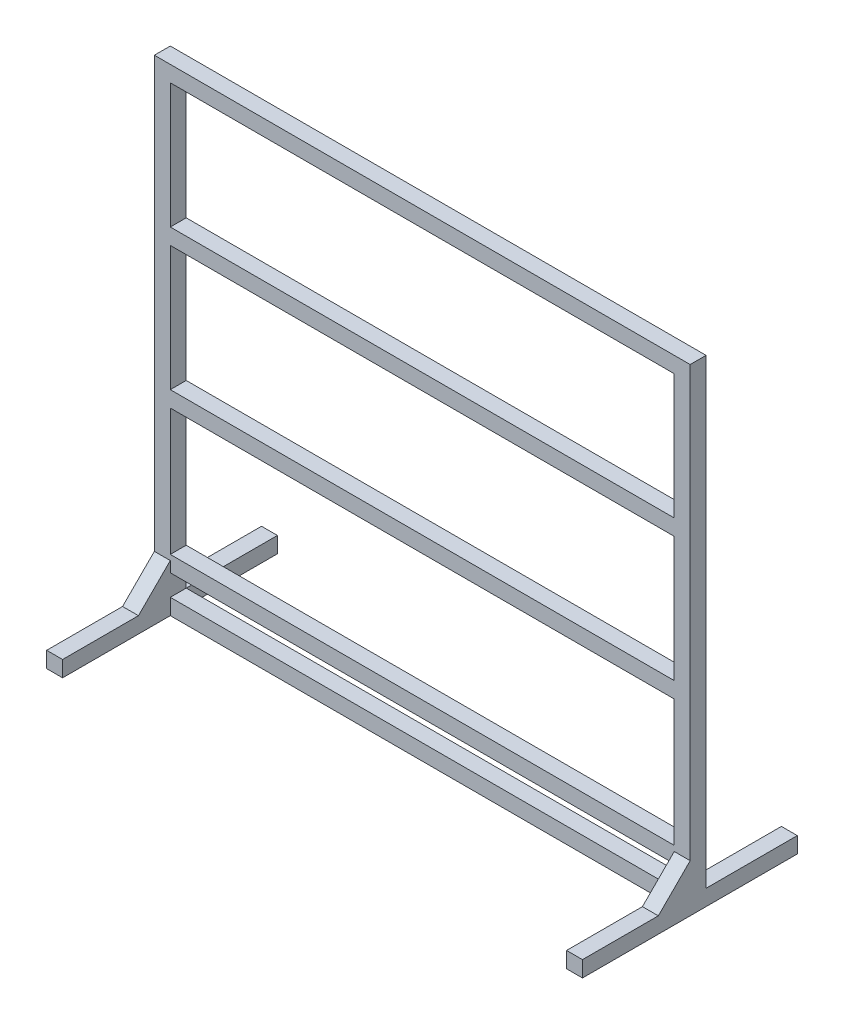
ISO-10303-21;
HEADER;
FILE_DESCRIPTION(('STEP AP214'),'2;1');
FILE_NAME('part.step','',(''),(''),'','','');
FILE_SCHEMA(('AUTOMOTIVE_DESIGN { 1 0 10303 214 1 1 1 1 }'));
ENDSEC;
DATA;
#1=APPLICATION_CONTEXT('core data for automotive mechanical design processes');
#2=APPLICATION_PROTOCOL_DEFINITION('international standard','automotive_design',2000,#1);
#3=PRODUCT_CONTEXT('',#1,'mechanical');
#4=PRODUCT('Part','Part','',(#3));
#5=PRODUCT_RELATED_PRODUCT_CATEGORY('part','',(#4));
#6=PRODUCT_DEFINITION_FORMATION('','',#4);
#7=PRODUCT_DEFINITION_CONTEXT('part definition',#1,'design');
#8=PRODUCT_DEFINITION('design','',#6,#7);
#9=PRODUCT_DEFINITION_SHAPE('','',#8);
#10=(LENGTH_UNIT() NAMED_UNIT(*) SI_UNIT(.MILLI.,.METRE.));
#11=(NAMED_UNIT(*) PLANE_ANGLE_UNIT() SI_UNIT($,.RADIAN.));
#12=(NAMED_UNIT(*) SI_UNIT($,.STERADIAN.) SOLID_ANGLE_UNIT());
#13=UNCERTAINTY_MEASURE_WITH_UNIT(LENGTH_MEASURE(1.E-05),#10,'distance_accuracy_value','');
#14=(GEOMETRIC_REPRESENTATION_CONTEXT(3) GLOBAL_UNCERTAINTY_ASSIGNED_CONTEXT((#13)) GLOBAL_UNIT_ASSIGNED_CONTEXT((#10,
#11,#12)) REPRESENTATION_CONTEXT('',''));
#15=CARTESIAN_POINT('',(0.,0.,0.));
#16=DIRECTION('',(0.,0.,1.));
#17=DIRECTION('',(1.,0.,0.));
#18=AXIS2_PLACEMENT_3D('',#15,#16,#17);
#19=CARTESIAN_POINT('',(0.,0.,0.));
#20=DIRECTION('',(0.,0.,1.));
#21=DIRECTION('',(1.,0.,0.));
#22=AXIS2_PLACEMENT_3D('',#19,#20,#21);
#23=PLANE('',#22);
#24=DIRECTION('',(0.,1.,0.));
#25=VECTOR('',#24,1.);
#26=CARTESIAN_POINT('',(980.,-870.,0.));
#27=LINE('',#26,#25);
#28=CARTESIAN_POINT('',(980.,-900.,0.));
#29=VERTEX_POINT('',#28);
#30=CARTESIAN_POINT('',(980.,-870.,0.));
#31=VERTEX_POINT('',#30);
#32=EDGE_CURVE('E514',#29,#31,#27,.T.);
#33=ORIENTED_EDGE('',*,*,#32,.F.);
#34=DIRECTION('',(1.,0.,0.));
#35=VECTOR('',#34,1.);
#36=CARTESIAN_POINT('',(0.,-900.,0.));
#37=LINE('',#36,#35);
#38=CARTESIAN_POINT('',(30.,-900.,0.));
#39=VERTEX_POINT('',#38);
#40=EDGE_CURVE('E305',#39,#29,#37,.T.);
#41=ORIENTED_EDGE('',*,*,#40,.F.);
#42=DIRECTION('',(0.,-1.,0.));
#43=VECTOR('',#42,1.);
#44=CARTESIAN_POINT('',(30.,-870.,0.));
#45=LINE('',#44,#43);
#46=CARTESIAN_POINT('',(30.,-870.,0.));
#47=VERTEX_POINT('',#46);
#48=EDGE_CURVE('E538',#47,#39,#45,.T.);
#49=ORIENTED_EDGE('',*,*,#48,.F.);
#50=DIRECTION('',(1.,0.,0.));
#51=VECTOR('',#50,1.);
#52=CARTESIAN_POINT('',(0.,-870.,0.));
#53=LINE('',#52,#51);
#54=EDGE_CURVE('E256',#47,#31,#53,.T.);
#55=ORIENTED_EDGE('',*,*,#54,.T.);
#56=EDGE_LOOP('',(#33,#41,#49,#55));
#57=FACE_BOUND('',#56,.T.);
#58=ADVANCED_FACE('F35',(#57),#23,.F.);
#59=DIRECTION('',(0.,-1.,0.));
#60=VECTOR('',#59,1.);
#61=CARTESIAN_POINT('',(30.,0.,0.));
#62=LINE('',#61,#60);
#63=CARTESIAN_POINT('',(30.,-295.5,0.));
#64=VERTEX_POINT('',#63);
#65=CARTESIAN_POINT('',(30.,-531.,0.));
#66=VERTEX_POINT('',#65);
#67=EDGE_CURVE('E300',#64,#66,#62,.T.);
#68=ORIENTED_EDGE('',*,*,#67,.T.);
#69=DIRECTION('',(1.,0.,0.));
#70=VECTOR('',#69,1.);
#71=CARTESIAN_POINT('',(0.,-531.,0.));
#72=LINE('',#71,#70);
#73=CARTESIAN_POINT('',(980.,-531.,0.));
#74=VERTEX_POINT('',#73);
#75=EDGE_CURVE('E348',#66,#74,#72,.T.);
#76=ORIENTED_EDGE('',*,*,#75,.T.);
#77=DIRECTION('',(0.,-1.,0.));
#78=VECTOR('',#77,1.);
#79=CARTESIAN_POINT('',(980.,0.,0.));
#80=LINE('',#79,#78);
#81=CARTESIAN_POINT('',(980.,-295.5,0.));
#82=VERTEX_POINT('',#81);
#83=EDGE_CURVE('E345',#82,#74,#80,.T.);
#84=ORIENTED_EDGE('',*,*,#83,.F.);
#85=DIRECTION('',(1.,0.,0.));
#86=VECTOR('',#85,1.);
#87=CARTESIAN_POINT('',(0.,-295.5,0.));
#88=LINE('',#87,#86);
#89=EDGE_CURVE('E341',#64,#82,#88,.T.);
#90=ORIENTED_EDGE('',*,*,#89,.F.);
#91=EDGE_LOOP('',(#68,#76,#84,#90));
#92=FACE_BOUND('',#91,.T.);
#93=CARTESIAN_POINT('',(30.,-561.,0.));
#94=VERTEX_POINT('',#93);
#95=CARTESIAN_POINT('',(30.,-800.,0.));
#96=VERTEX_POINT('',#95);
#97=EDGE_CURVE('E343',#94,#96,#62,.T.);
#98=ORIENTED_EDGE('',*,*,#97,.T.);
#99=DIRECTION('',(1.,0.,0.));
#100=VECTOR('',#99,1.);
#101=CARTESIAN_POINT('',(0.,-800.,0.));
#102=LINE('',#101,#100);
#103=CARTESIAN_POINT('',(980.,-800.,0.));
#104=VERTEX_POINT('',#103);
#105=EDGE_CURVE('E356',#96,#104,#102,.T.);
#106=ORIENTED_EDGE('',*,*,#105,.T.);
#107=CARTESIAN_POINT('',(980.,-561.,0.));
#108=VERTEX_POINT('',#107);
#109=EDGE_CURVE('E350',#108,#104,#80,.T.);
#110=ORIENTED_EDGE('',*,*,#109,.F.);
#111=DIRECTION('',(1.,0.,0.));
#112=VECTOR('',#111,1.);
#113=CARTESIAN_POINT('',(0.,-561.,0.));
#114=LINE('',#113,#112);
#115=EDGE_CURVE('E353',#94,#108,#114,.T.);
#116=ORIENTED_EDGE('',*,*,#115,.F.);
#117=EDGE_LOOP('',(#98,#106,#110,#116));
#118=FACE_BOUND('',#117,.T.);
#119=CARTESIAN_POINT('',(30.,-30.,0.));
#120=VERTEX_POINT('',#119);
#121=CARTESIAN_POINT('',(30.,-265.5,0.));
#122=VERTEX_POINT('',#121);
#123=EDGE_CURVE('E342',#120,#122,#62,.T.);
#124=ORIENTED_EDGE('',*,*,#123,.T.);
#125=DIRECTION('',(1.,0.,0.));
#126=VECTOR('',#125,1.);
#127=CARTESIAN_POINT('',(0.,-265.5,0.));
#128=LINE('',#127,#126);
#129=CARTESIAN_POINT('',(980.,-265.5,0.));
#130=VERTEX_POINT('',#129);
#131=EDGE_CURVE('E368',#122,#130,#128,.T.);
#132=ORIENTED_EDGE('',*,*,#131,.T.);
#133=CARTESIAN_POINT('',(980.,-30.,0.));
#134=VERTEX_POINT('',#133);
#135=EDGE_CURVE('E349',#134,#130,#80,.T.);
#136=ORIENTED_EDGE('',*,*,#135,.F.);
#137=DIRECTION('',(1.,0.,0.));
#138=VECTOR('',#137,1.);
#139=CARTESIAN_POINT('',(0.,-30.,0.));
#140=LINE('',#139,#138);
#141=EDGE_CURVE('E365',#120,#134,#140,.T.);
#142=ORIENTED_EDGE('',*,*,#141,.F.);
#143=EDGE_LOOP('',(#124,#132,#136,#142));
#144=FACE_BOUND('',#143,.T.);
#145=DIRECTION('',(1.,0.,0.));
#146=VECTOR('',#145,1.);
#147=CARTESIAN_POINT('',(980.,-870.,0.));
#148=LINE('',#147,#146);
#149=CARTESIAN_POINT('',(1010.,-870.,0.));
#150=VERTEX_POINT('',#149);
#151=EDGE_CURVE('E521',#31,#150,#148,.T.);
#152=ORIENTED_EDGE('',*,*,#151,.F.);
#153=CARTESIAN_POINT('',(980.,-830.,0.));
#154=VERTEX_POINT('',#153);
#155=EDGE_CURVE('E363',#154,#31,#80,.T.);
#156=ORIENTED_EDGE('',*,*,#155,.F.);
#157=DIRECTION('',(1.,0.,0.));
#158=VECTOR('',#157,1.);
#159=CARTESIAN_POINT('',(0.,-830.,0.));
#160=LINE('',#159,#158);
#161=CARTESIAN_POINT('',(30.,-830.,0.));
#162=VERTEX_POINT('',#161);
#163=EDGE_CURVE('E360',#162,#154,#160,.T.);
#164=ORIENTED_EDGE('',*,*,#163,.F.);
#165=EDGE_CURVE('E359',#162,#47,#62,.T.);
#166=ORIENTED_EDGE('',*,*,#165,.T.);
#167=DIRECTION('',(1.,0.,0.));
#168=VECTOR('',#167,1.);
#169=CARTESIAN_POINT('',(30.,-870.,0.));
#170=LINE('',#169,#168);
#171=CARTESIAN_POINT('',(1.0654427152582E-13,-870.,0.));
#172=VERTEX_POINT('',#171);
#173=EDGE_CURVE('E543',#172,#47,#170,.T.);
#174=ORIENTED_EDGE('',*,*,#173,.F.);
#175=DIRECTION('',(0.,-1.,0.));
#176=VECTOR('',#175,1.);
#177=CARTESIAN_POINT('',(0.,0.,0.));
#178=LINE('',#177,#176);
#179=CARTESIAN_POINT('',(0.,0.,0.));
#180=VERTEX_POINT('',#179);
#181=EDGE_CURVE('E377',#180,#172,#178,.T.);
#182=ORIENTED_EDGE('',*,*,#181,.F.);
#183=DIRECTION('',(1.,0.,0.));
#184=VECTOR('',#183,1.);
#185=CARTESIAN_POINT('',(0.,0.,0.));
#186=LINE('',#185,#184);
#187=CARTESIAN_POINT('',(1010.,0.,0.));
#188=VERTEX_POINT('',#187);
#189=EDGE_CURVE('E374',#180,#188,#186,.T.);
#190=ORIENTED_EDGE('',*,*,#189,.T.);
#191=DIRECTION('',(0.,-1.,0.));
#192=VECTOR('',#191,1.);
#193=CARTESIAN_POINT('',(1010.,0.,0.));
#194=LINE('',#193,#192);
#195=EDGE_CURVE('E371',#188,#150,#194,.T.);
#196=ORIENTED_EDGE('',*,*,#195,.T.);
#197=EDGE_LOOP('',(#152,#156,#164,#166,#174,#182,#190,#196));
#198=FACE_BOUND('',#197,.T.);
#199=ADVANCED_FACE('F425',(#92,#118,#144,#198),#23,.F.);
#200=CARTESIAN_POINT('',(0.,0.,30.));
#201=DIRECTION('',(0.,0.,1.));
#202=DIRECTION('',(1.,0.,0.));
#203=AXIS2_PLACEMENT_3D('',#200,#201,#202);
#204=PLANE('',#203);
#205=DIRECTION('',(1.,0.,0.));
#206=VECTOR('',#205,1.);
#207=CARTESIAN_POINT('',(0.,-900.,30.));
#208=LINE('',#207,#206);
#209=CARTESIAN_POINT('',(30.,-900.,30.));
#210=VERTEX_POINT('',#209);
#211=CARTESIAN_POINT('',(980.,-900.,30.));
#212=VERTEX_POINT('',#211);
#213=EDGE_CURVE('E336',#210,#212,#208,.T.);
#214=ORIENTED_EDGE('',*,*,#213,.T.);
#215=DIRECTION('',(0.,-1.,0.));
#216=VECTOR('',#215,1.);
#217=CARTESIAN_POINT('',(980.,-870.,30.));
#218=LINE('',#217,#216);
#219=CARTESIAN_POINT('',(980.,-870.,30.));
#220=VERTEX_POINT('',#219);
#221=EDGE_CURVE('E271',#220,#212,#218,.T.);
#222=ORIENTED_EDGE('',*,*,#221,.F.);
#223=DIRECTION('',(1.,0.,0.));
#224=VECTOR('',#223,1.);
#225=CARTESIAN_POINT('',(0.,-870.,30.));
#226=LINE('',#225,#224);
#227=CARTESIAN_POINT('',(30.0000000000001,-870.,30.));
#228=VERTEX_POINT('',#227);
#229=EDGE_CURVE('E254',#228,#220,#226,.T.);
#230=ORIENTED_EDGE('',*,*,#229,.F.);
#231=DIRECTION('',(0.,1.,0.));
#232=VECTOR('',#231,1.);
#233=CARTESIAN_POINT('',(30.,-870.,30.));
#234=LINE('',#233,#232);
#235=EDGE_CURVE('E268',#210,#228,#234,.T.);
#236=ORIENTED_EDGE('',*,*,#235,.F.);
#237=EDGE_LOOP('',(#214,#222,#230,#236));
#238=FACE_BOUND('',#237,.T.);
#239=ADVANCED_FACE('F267',(#238),#204,.T.);
#240=DIRECTION('',(1.,0.,0.));
#241=VECTOR('',#240,1.);
#242=CARTESIAN_POINT('',(980.,-810.,30.));
#243=LINE('',#242,#241);
#244=CARTESIAN_POINT('',(980.,-810.,30.));
#245=VERTEX_POINT('',#244);
#246=CARTESIAN_POINT('',(1010.,-810.,30.));
#247=VERTEX_POINT('',#246);
#248=EDGE_CURVE('E56',#245,#247,#243,.T.);
#249=ORIENTED_EDGE('',*,*,#248,.T.);
#250=DIRECTION('',(0.,-1.,0.));
#251=VECTOR('',#250,1.);
#252=CARTESIAN_POINT('',(1010.,0.,30.));
#253=LINE('',#252,#251);
#254=CARTESIAN_POINT('',(1010.,0.,30.));
#255=VERTEX_POINT('',#254);
#256=EDGE_CURVE('E328',#255,#247,#253,.T.);
#257=ORIENTED_EDGE('',*,*,#256,.F.);
#258=DIRECTION('',(1.,0.,0.));
#259=VECTOR('',#258,1.);
#260=CARTESIAN_POINT('',(0.,0.,30.));
#261=LINE('',#260,#259);
#262=CARTESIAN_POINT('',(0.,0.,30.));
#263=VERTEX_POINT('',#262);
#264=EDGE_CURVE('E330',#263,#255,#261,.T.);
#265=ORIENTED_EDGE('',*,*,#264,.F.);
#266=DIRECTION('',(0.,-1.,0.));
#267=VECTOR('',#266,1.);
#268=CARTESIAN_POINT('',(0.,0.,30.));
#269=LINE('',#268,#267);
#270=CARTESIAN_POINT('',(0.,-810.,30.));
#271=VERTEX_POINT('',#270);
#272=EDGE_CURVE('E333',#263,#271,#269,.T.);
#273=ORIENTED_EDGE('',*,*,#272,.T.);
#274=DIRECTION('',(-1.,0.,0.));
#275=VECTOR('',#274,1.);
#276=CARTESIAN_POINT('',(30.0000000000001,-810.,30.));
#277=LINE('',#276,#275);
#278=CARTESIAN_POINT('',(30.0000000000001,-810.,30.));
#279=VERTEX_POINT('',#278);
#280=EDGE_CURVE('E512',#279,#271,#277,.T.);
#281=ORIENTED_EDGE('',*,*,#280,.F.);
#282=DIRECTION('',(0.,-1.,0.));
#283=VECTOR('',#282,1.);
#284=CARTESIAN_POINT('',(30.0000000000001,-870.,30.));
#285=LINE('',#284,#283);
#286=CARTESIAN_POINT('',(30.0000000000001,-830.,30.));
#287=VERTEX_POINT('',#286);
#288=EDGE_CURVE('E504',#279,#287,#285,.T.);
#289=ORIENTED_EDGE('',*,*,#288,.T.);
#290=DIRECTION('',(1.,0.,0.));
#291=VECTOR('',#290,1.);
#292=CARTESIAN_POINT('',(0.,-830.,30.));
#293=LINE('',#292,#291);
#294=CARTESIAN_POINT('',(980.,-830.,30.));
#295=VERTEX_POINT('',#294);
#296=EDGE_CURVE('E274',#287,#295,#293,.T.);
#297=ORIENTED_EDGE('',*,*,#296,.T.);
#298=DIRECTION('',(0.,1.,0.));
#299=VECTOR('',#298,1.);
#300=CARTESIAN_POINT('',(980.,-810.,30.));
#301=LINE('',#300,#299);
#302=EDGE_CURVE('E52',#295,#245,#301,.T.);
#303=ORIENTED_EDGE('',*,*,#302,.T.);
#304=EDGE_LOOP('',(#249,#257,#265,#273,#281,#289,#297,#303));
#305=FACE_BOUND('',#304,.T.);
#306=DIRECTION('',(0.,-1.,0.));
#307=VECTOR('',#306,1.);
#308=CARTESIAN_POINT('',(30.,0.,30.));
#309=LINE('',#308,#307);
#310=CARTESIAN_POINT('',(30.,-295.5,30.));
#311=VERTEX_POINT('',#310);
#312=CARTESIAN_POINT('',(30.,-531.,30.));
#313=VERTEX_POINT('',#312);
#314=EDGE_CURVE('E301',#311,#313,#309,.T.);
#315=ORIENTED_EDGE('',*,*,#314,.F.);
#316=DIRECTION('',(1.,0.,0.));
#317=VECTOR('',#316,1.);
#318=CARTESIAN_POINT('',(0.,-295.5,30.));
#319=LINE('',#318,#317);
#320=CARTESIAN_POINT('',(980.,-295.5,30.));
#321=VERTEX_POINT('',#320);
#322=EDGE_CURVE('E304',#311,#321,#319,.T.);
#323=ORIENTED_EDGE('',*,*,#322,.T.);
#324=DIRECTION('',(0.,-1.,0.));
#325=VECTOR('',#324,1.);
#326=CARTESIAN_POINT('',(980.,0.,30.));
#327=LINE('',#326,#325);
#328=CARTESIAN_POINT('',(980.,-531.,30.));
#329=VERTEX_POINT('',#328);
#330=EDGE_CURVE('E308',#321,#329,#327,.T.);
#331=ORIENTED_EDGE('',*,*,#330,.T.);
#332=DIRECTION('',(1.,0.,0.));
#333=VECTOR('',#332,1.);
#334=CARTESIAN_POINT('',(0.,-531.,30.));
#335=LINE('',#334,#333);
#336=EDGE_CURVE('E310',#313,#329,#335,.T.);
#337=ORIENTED_EDGE('',*,*,#336,.F.);
#338=EDGE_LOOP('',(#315,#323,#331,#337));
#339=FACE_BOUND('',#338,.T.);
#340=CARTESIAN_POINT('',(30.,-561.,30.));
#341=VERTEX_POINT('',#340);
#342=CARTESIAN_POINT('',(30.,-800.,30.));
#343=VERTEX_POINT('',#342);
#344=EDGE_CURVE('E306',#341,#343,#309,.T.);
#345=ORIENTED_EDGE('',*,*,#344,.F.);
#346=DIRECTION('',(1.,0.,0.));
#347=VECTOR('',#346,1.);
#348=CARTESIAN_POINT('',(0.,-561.,30.));
#349=LINE('',#348,#347);
#350=CARTESIAN_POINT('',(980.,-561.,30.));
#351=VERTEX_POINT('',#350);
#352=EDGE_CURVE('E315',#341,#351,#349,.T.);
#353=ORIENTED_EDGE('',*,*,#352,.T.);
#354=CARTESIAN_POINT('',(980.,-800.,30.));
#355=VERTEX_POINT('',#354);
#356=EDGE_CURVE('E312',#351,#355,#327,.T.);
#357=ORIENTED_EDGE('',*,*,#356,.T.);
#358=DIRECTION('',(1.,0.,0.));
#359=VECTOR('',#358,1.);
#360=CARTESIAN_POINT('',(0.,-800.,30.));
#361=LINE('',#360,#359);
#362=EDGE_CURVE('E318',#343,#355,#361,.T.);
#363=ORIENTED_EDGE('',*,*,#362,.F.);
#364=EDGE_LOOP('',(#345,#353,#357,#363));
#365=FACE_BOUND('',#364,.T.);
#366=CARTESIAN_POINT('',(30.,-30.,30.));
#367=VERTEX_POINT('',#366);
#368=CARTESIAN_POINT('',(30.,-265.5,30.));
#369=VERTEX_POINT('',#368);
#370=EDGE_CURVE('E273',#367,#369,#309,.T.);
#371=ORIENTED_EDGE('',*,*,#370,.F.);
#372=DIRECTION('',(1.,0.,0.));
#373=VECTOR('',#372,1.);
#374=CARTESIAN_POINT('',(0.,-30.,30.));
#375=LINE('',#374,#373);
#376=CARTESIAN_POINT('',(980.,-30.,30.));
#377=VERTEX_POINT('',#376);
#378=EDGE_CURVE('E322',#367,#377,#375,.T.);
#379=ORIENTED_EDGE('',*,*,#378,.T.);
#380=CARTESIAN_POINT('',(980.,-265.5,30.));
#381=VERTEX_POINT('',#380);
#382=EDGE_CURVE('E311',#377,#381,#327,.T.);
#383=ORIENTED_EDGE('',*,*,#382,.T.);
#384=DIRECTION('',(1.,0.,0.));
#385=VECTOR('',#384,1.);
#386=CARTESIAN_POINT('',(0.,-265.5,30.));
#387=LINE('',#386,#385);
#388=EDGE_CURVE('E325',#369,#381,#387,.T.);
#389=ORIENTED_EDGE('',*,*,#388,.F.);
#390=EDGE_LOOP('',(#371,#379,#383,#389));
#391=FACE_BOUND('',#390,.T.);
#392=ADVANCED_FACE('F479',(#305,#339,#365,#391),#204,.T.);
#393=CARTESIAN_POINT('',(1010.,0.,30.));
#394=DIRECTION('',(1.,0.,0.));
#395=DIRECTION('',(0.,0.,-1.));
#396=AXIS2_PLACEMENT_3D('',#393,#394,#395);
#397=PLANE('',#396);
#398=ORIENTED_EDGE('',*,*,#256,.T.);
#399=DIRECTION('',(0.,-0.707106781186547,0.707106781186548));
#400=VECTOR('',#399,1.);
#401=CARTESIAN_POINT('',(1010.,-870.,90.));
#402=LINE('',#401,#400);
#403=CARTESIAN_POINT('',(1010.,-870.,90.0000000000001));
#404=VERTEX_POINT('',#403);
#405=EDGE_CURVE('E487',#247,#404,#402,.T.);
#406=ORIENTED_EDGE('',*,*,#405,.T.);
#407=DIRECTION('',(0.,0.,-1.));
#408=VECTOR('',#407,1.);
#409=CARTESIAN_POINT('',(1010.,-870.,233.));
#410=LINE('',#409,#408);
#411=CARTESIAN_POINT('',(1010.,-870.,233.));
#412=VERTEX_POINT('',#411);
#413=EDGE_CURVE('E287',#412,#404,#410,.T.);
#414=ORIENTED_EDGE('',*,*,#413,.F.);
#415=DIRECTION('',(0.,1.,0.));
#416=VECTOR('',#415,1.);
#417=CARTESIAN_POINT('',(1010.,-870.,233.));
#418=LINE('',#417,#416);
#419=CARTESIAN_POINT('',(1010.,-900.,233.));
#420=VERTEX_POINT('',#419);
#421=EDGE_CURVE('E569',#420,#412,#418,.T.);
#422=ORIENTED_EDGE('',*,*,#421,.F.);
#423=DIRECTION('',(0.,0.,-1.));
#424=VECTOR('',#423,1.);
#425=CARTESIAN_POINT('',(1010.,-900.,30.));
#426=LINE('',#425,#424);
#427=CARTESIAN_POINT('',(1010.,-900.,-172.));
#428=VERTEX_POINT('',#427);
#429=EDGE_CURVE('E382',#420,#428,#426,.T.);
#430=ORIENTED_EDGE('',*,*,#429,.T.);
#431=DIRECTION('',(0.,-1.,0.));
#432=VECTOR('',#431,1.);
#433=CARTESIAN_POINT('',(1010.,-870.,-172.));
#434=LINE('',#433,#432);
#435=CARTESIAN_POINT('',(1010.,-870.,-172.));
#436=VERTEX_POINT('',#435);
#437=EDGE_CURVE('E523',#436,#428,#434,.T.);
#438=ORIENTED_EDGE('',*,*,#437,.F.);
#439=DIRECTION('',(0.,0.,1.));
#440=VECTOR('',#439,1.);
#441=CARTESIAN_POINT('',(1010.,-870.,-172.));
#442=LINE('',#441,#440);
#443=EDGE_CURVE('E533',#436,#150,#442,.T.);
#444=ORIENTED_EDGE('',*,*,#443,.T.);
#445=ORIENTED_EDGE('',*,*,#195,.F.);
#446=DIRECTION('',(0.,0.,-1.));
#447=VECTOR('',#446,1.);
#448=CARTESIAN_POINT('',(1010.,0.,30.));
#449=LINE('',#448,#447);
#450=EDGE_CURVE('E11',#255,#188,#449,.T.);
#451=ORIENTED_EDGE('',*,*,#450,.F.);
#452=EDGE_LOOP('',(#398,#406,#414,#422,#430,#438,#444,#445,#451));
#453=FACE_BOUND('',#452,.T.);
#454=ADVANCED_FACE('F476',(#453),#397,.T.);
#455=CARTESIAN_POINT('',(0.,0.,30.));
#456=DIRECTION('',(0.,1.,0.));
#457=DIRECTION('',(0.,0.,1.));
#458=AXIS2_PLACEMENT_3D('',#455,#456,#457);
#459=PLANE('',#458);
#460=ORIENTED_EDGE('',*,*,#189,.F.);
#461=DIRECTION('',(0.,0.,-1.));
#462=VECTOR('',#461,1.);
#463=CARTESIAN_POINT('',(0.,0.,30.));
#464=LINE('',#463,#462);
#465=EDGE_CURVE('E44',#263,#180,#464,.T.);
#466=ORIENTED_EDGE('',*,*,#465,.F.);
#467=ORIENTED_EDGE('',*,*,#264,.T.);
#468=ORIENTED_EDGE('',*,*,#450,.T.);
#469=EDGE_LOOP('',(#460,#466,#467,#468));
#470=FACE_BOUND('',#469,.T.);
#471=ADVANCED_FACE('F472',(#470),#459,.T.);
#472=CARTESIAN_POINT('',(0.,0.,30.));
#473=DIRECTION('',(1.,0.,0.));
#474=DIRECTION('',(0.,1.,0.));
#475=AXIS2_PLACEMENT_3D('',#472,#473,#474);
#476=PLANE('',#475);
#477=ORIENTED_EDGE('',*,*,#181,.T.);
#478=DIRECTION('',(0.,0.,1.));
#479=VECTOR('',#478,1.);
#480=CARTESIAN_POINT('',(1.10218211923262E-13,-870.,-172.));
#481=LINE('',#480,#479);
#482=CARTESIAN_POINT('',(1.10218211923262E-13,-870.,-172.));
#483=VERTEX_POINT('',#482);
#484=EDGE_CURVE('E557',#483,#172,#481,.T.);
#485=ORIENTED_EDGE('',*,*,#484,.F.);
#486=DIRECTION('',(0.,1.,0.));
#487=VECTOR('',#486,1.);
#488=CARTESIAN_POINT('',(1.10218211923262E-13,-870.,-172.));
#489=LINE('',#488,#487);
#490=CARTESIAN_POINT('',(1.10218211923262E-13,-900.,-172.));
#491=VERTEX_POINT('',#490);
#492=EDGE_CURVE('E546',#491,#483,#489,.T.);
#493=ORIENTED_EDGE('',*,*,#492,.F.);
#494=DIRECTION('',(0.,0.,-1.));
#495=VECTOR('',#494,1.);
#496=CARTESIAN_POINT('',(1.10218211923262E-13,-900.,30.));
#497=LINE('',#496,#495);
#498=CARTESIAN_POINT('',(1.10218211923262E-13,-900.,233.));
#499=VERTEX_POINT('',#498);
#500=EDGE_CURVE('E384',#499,#491,#497,.T.);
#501=ORIENTED_EDGE('',*,*,#500,.F.);
#502=DIRECTION('',(0.,-1.,0.));
#503=VECTOR('',#502,1.);
#504=CARTESIAN_POINT('',(1.10218211923262E-13,-870.,233.));
#505=LINE('',#504,#503);
#506=CARTESIAN_POINT('',(1.10218211923262E-13,-870.,233.));
#507=VERTEX_POINT('',#506);
#508=EDGE_CURVE('E578',#507,#499,#505,.T.);
#509=ORIENTED_EDGE('',*,*,#508,.F.);
#510=DIRECTION('',(0.,0.,-1.));
#511=VECTOR('',#510,1.);
#512=CARTESIAN_POINT('',(1.10218211923262E-13,-870.,233.));
#513=LINE('',#512,#511);
#514=CARTESIAN_POINT('',(1.0654427152582E-13,-870.,90.));
#515=VERTEX_POINT('',#514);
#516=EDGE_CURVE('E294',#507,#515,#513,.T.);
#517=ORIENTED_EDGE('',*,*,#516,.T.);
#518=DIRECTION('',(0.,0.707106781186547,-0.707106781186548));
#519=VECTOR('',#518,1.);
#520=CARTESIAN_POINT('',(0.,-810.,30.));
#521=LINE('',#520,#519);
#522=EDGE_CURVE('E502',#515,#271,#521,.T.);
#523=ORIENTED_EDGE('',*,*,#522,.T.);
#524=ORIENTED_EDGE('',*,*,#272,.F.);
#525=ORIENTED_EDGE('',*,*,#465,.T.);
#526=EDGE_LOOP('',(#477,#485,#493,#501,#509,#517,#523,#524,#525));
#527=FACE_BOUND('',#526,.T.);
#528=ADVANCED_FACE('F468',(#527),#476,.F.);
#529=CARTESIAN_POINT('',(30.,0.,30.));
#530=DIRECTION('',(1.,0.,0.));
#531=DIRECTION('',(0.,0.,-1.));
#532=AXIS2_PLACEMENT_3D('',#529,#530,#531);
#533=PLANE('',#532);
#534=ORIENTED_EDGE('',*,*,#123,.F.);
#535=DIRECTION('',(0.,0.,-1.));
#536=VECTOR('',#535,1.);
#537=CARTESIAN_POINT('',(30.,-30.,30.));
#538=LINE('',#537,#536);
#539=EDGE_CURVE('E385',#367,#120,#538,.T.);
#540=ORIENTED_EDGE('',*,*,#539,.F.);
#541=ORIENTED_EDGE('',*,*,#370,.T.);
#542=DIRECTION('',(0.,0.,-1.));
#543=VECTOR('',#542,1.);
#544=CARTESIAN_POINT('',(30.,-265.5,30.));
#545=LINE('',#544,#543);
#546=EDGE_CURVE('E388',#369,#122,#545,.T.);
#547=ORIENTED_EDGE('',*,*,#546,.T.);
#548=EDGE_LOOP('',(#534,#540,#541,#547));
#549=FACE_BOUND('',#548,.T.);
#550=ADVANCED_FACE('F471',(#549),#533,.T.);
#551=CARTESIAN_POINT('',(0.,-30.,30.));
#552=DIRECTION('',(0.,1.,0.));
#553=DIRECTION('',(0.,0.,1.));
#554=AXIS2_PLACEMENT_3D('',#551,#552,#553);
#555=PLANE('',#554);
#556=ORIENTED_EDGE('',*,*,#141,.T.);
#557=DIRECTION('',(0.,0.,-1.));
#558=VECTOR('',#557,1.);
#559=CARTESIAN_POINT('',(980.,-30.,30.));
#560=LINE('',#559,#558);
#561=EDGE_CURVE('E393',#377,#134,#560,.T.);
#562=ORIENTED_EDGE('',*,*,#561,.F.);
#563=ORIENTED_EDGE('',*,*,#378,.F.);
#564=ORIENTED_EDGE('',*,*,#539,.T.);
#565=EDGE_LOOP('',(#556,#562,#563,#564));
#566=FACE_BOUND('',#565,.T.);
#567=ADVANCED_FACE('F451',(#566),#555,.F.);
#568=CARTESIAN_POINT('',(980.,0.,30.));
#569=DIRECTION('',(1.,0.,0.));
#570=DIRECTION('',(0.,0.,-1.));
#571=AXIS2_PLACEMENT_3D('',#568,#569,#570);
#572=PLANE('',#571);
#573=ORIENTED_EDGE('',*,*,#135,.T.);
#574=DIRECTION('',(0.,0.,-1.));
#575=VECTOR('',#574,1.);
#576=CARTESIAN_POINT('',(980.,-265.5,30.));
#577=LINE('',#576,#575);
#578=EDGE_CURVE('E390',#381,#130,#577,.T.);
#579=ORIENTED_EDGE('',*,*,#578,.F.);
#580=ORIENTED_EDGE('',*,*,#382,.F.);
#581=ORIENTED_EDGE('',*,*,#561,.T.);
#582=EDGE_LOOP('',(#573,#579,#580,#581));
#583=FACE_BOUND('',#582,.T.);
#584=ADVANCED_FACE('F438',(#583),#572,.F.);
#585=ORIENTED_EDGE('',*,*,#165,.F.);
#586=DIRECTION('',(0.,0.,-1.));
#587=VECTOR('',#586,1.);
#588=CARTESIAN_POINT('',(30.,-830.,30.));
#589=LINE('',#588,#587);
#590=EDGE_CURVE('E391',#287,#162,#589,.T.);
#591=ORIENTED_EDGE('',*,*,#590,.F.);
#592=ORIENTED_EDGE('',*,*,#288,.F.);
#593=DIRECTION('',(0.,0.707106781186547,-0.707106781186548));
#594=VECTOR('',#593,1.);
#595=CARTESIAN_POINT('',(30.0000000000001,-810.,30.));
#596=LINE('',#595,#594);
#597=CARTESIAN_POINT('',(30.0000000000001,-870.,90.));
#598=VERTEX_POINT('',#597);
#599=EDGE_CURVE('E506',#598,#279,#596,.T.);
#600=ORIENTED_EDGE('',*,*,#599,.F.);
#601=DIRECTION('',(0.,0.,-1.));
#602=VECTOR('',#601,1.);
#603=CARTESIAN_POINT('',(30.,-870.,233.));
#604=LINE('',#603,#602);
#605=CARTESIAN_POINT('',(30.,-870.,233.));
#606=VERTEX_POINT('',#605);
#607=EDGE_CURVE('E297',#606,#598,#604,.T.);
#608=ORIENTED_EDGE('',*,*,#607,.F.);
#609=DIRECTION('',(0.,1.,0.));
#610=VECTOR('',#609,1.);
#611=CARTESIAN_POINT('',(30.,-870.,233.));
#612=LINE('',#611,#610);
#613=CARTESIAN_POINT('',(30.,-900.,233.));
#614=VERTEX_POINT('',#613);
#615=EDGE_CURVE('E281',#614,#606,#612,.T.);
#616=ORIENTED_EDGE('',*,*,#615,.F.);
#617=DIRECTION('',(0.,0.,-1.));
#618=VECTOR('',#617,1.);
#619=CARTESIAN_POINT('',(30.,-900.,233.));
#620=LINE('',#619,#618);
#621=EDGE_CURVE('E280',#614,#210,#620,.T.);
#622=ORIENTED_EDGE('',*,*,#621,.T.);
#623=ORIENTED_EDGE('',*,*,#235,.T.);
#624=DIRECTION('',(0.,0.,-1.));
#625=VECTOR('',#624,1.);
#626=CARTESIAN_POINT('',(30.,-870.,30.));
#627=LINE('',#626,#625);
#628=EDGE_CURVE('E250',#228,#47,#627,.T.);
#629=ORIENTED_EDGE('',*,*,#628,.T.);
#630=EDGE_LOOP('',(#585,#591,#592,#600,#608,#616,#622,#623,#629));
#631=FACE_BOUND('',#630,.T.);
#632=ADVANCED_FACE('F277',(#631),#533,.T.);
#633=CARTESIAN_POINT('',(0.,-830.,30.));
#634=DIRECTION('',(0.,1.,0.));
#635=DIRECTION('',(0.,0.,1.));
#636=AXIS2_PLACEMENT_3D('',#633,#634,#635);
#637=PLANE('',#636);
#638=ORIENTED_EDGE('',*,*,#163,.T.);
#639=DIRECTION('',(0.,0.,-1.));
#640=VECTOR('',#639,1.);
#641=CARTESIAN_POINT('',(980.,-830.,30.));
#642=LINE('',#641,#640);
#643=EDGE_CURVE('E398',#295,#154,#642,.T.);
#644=ORIENTED_EDGE('',*,*,#643,.F.);
#645=ORIENTED_EDGE('',*,*,#296,.F.);
#646=ORIENTED_EDGE('',*,*,#590,.T.);
#647=EDGE_LOOP('',(#638,#644,#645,#646));
#648=FACE_BOUND('',#647,.T.);
#649=ADVANCED_FACE('F650',(#648),#637,.F.);
#650=ORIENTED_EDGE('',*,*,#155,.T.);
#651=DIRECTION('',(0.,0.,-1.));
#652=VECTOR('',#651,1.);
#653=CARTESIAN_POINT('',(980.,-870.,30.));
#654=LINE('',#653,#652);
#655=EDGE_CURVE('E262',#220,#31,#654,.T.);
#656=ORIENTED_EDGE('',*,*,#655,.F.);
#657=ORIENTED_EDGE('',*,*,#221,.T.);
#658=DIRECTION('',(0.,0.,-1.));
#659=VECTOR('',#658,1.);
#660=CARTESIAN_POINT('',(980.,-900.,233.));
#661=LINE('',#660,#659);
#662=CARTESIAN_POINT('',(980.,-900.,233.));
#663=VERTEX_POINT('',#662);
#664=EDGE_CURVE('E282',#663,#212,#661,.T.);
#665=ORIENTED_EDGE('',*,*,#664,.F.);
#666=DIRECTION('',(0.,-1.,0.));
#667=VECTOR('',#666,1.);
#668=CARTESIAN_POINT('',(980.,-870.,233.));
#669=LINE('',#668,#667);
#670=CARTESIAN_POINT('',(980.,-870.,233.));
#671=VERTEX_POINT('',#670);
#672=EDGE_CURVE('E563',#671,#663,#669,.T.);
#673=ORIENTED_EDGE('',*,*,#672,.F.);
#674=DIRECTION('',(0.,0.,-1.));
#675=VECTOR('',#674,1.);
#676=CARTESIAN_POINT('',(980.,-870.,233.));
#677=LINE('',#676,#675);
#678=CARTESIAN_POINT('',(980.,-870.,90.0000000000001));
#679=VERTEX_POINT('',#678);
#680=EDGE_CURVE('E573',#671,#679,#677,.T.);
#681=ORIENTED_EDGE('',*,*,#680,.T.);
#682=DIRECTION('',(0.,-0.707106781186547,0.707106781186548));
#683=VECTOR('',#682,1.);
#684=CARTESIAN_POINT('',(980.,-870.,90.));
#685=LINE('',#684,#683);
#686=EDGE_CURVE('E496',#245,#679,#685,.T.);
#687=ORIENTED_EDGE('',*,*,#686,.F.);
#688=ORIENTED_EDGE('',*,*,#302,.F.);
#689=ORIENTED_EDGE('',*,*,#643,.T.);
#690=EDGE_LOOP('',(#650,#656,#657,#665,#673,#681,#687,#688,#689));
#691=FACE_BOUND('',#690,.T.);
#692=ADVANCED_FACE('F449',(#691),#572,.F.);
#693=ORIENTED_EDGE('',*,*,#97,.F.);
#694=DIRECTION('',(0.,0.,-1.));
#695=VECTOR('',#694,1.);
#696=CARTESIAN_POINT('',(30.,-561.,30.));
#697=LINE('',#696,#695);
#698=EDGE_CURVE('E263',#341,#94,#697,.T.);
#699=ORIENTED_EDGE('',*,*,#698,.F.);
#700=ORIENTED_EDGE('',*,*,#344,.T.);
#701=DIRECTION('',(0.,0.,-1.));
#702=VECTOR('',#701,1.);
#703=CARTESIAN_POINT('',(30.,-800.,30.));
#704=LINE('',#703,#702);
#705=EDGE_CURVE('E402',#343,#96,#704,.T.);
#706=ORIENTED_EDGE('',*,*,#705,.T.);
#707=EDGE_LOOP('',(#693,#699,#700,#706));
#708=FACE_BOUND('',#707,.T.);
#709=ADVANCED_FACE('F639',(#708),#533,.T.);
#710=CARTESIAN_POINT('',(0.,-561.,30.));
#711=DIRECTION('',(0.,1.,0.));
#712=DIRECTION('',(0.,0.,1.));
#713=AXIS2_PLACEMENT_3D('',#710,#711,#712);
#714=PLANE('',#713);
#715=ORIENTED_EDGE('',*,*,#115,.T.);
#716=DIRECTION('',(0.,0.,-1.));
#717=VECTOR('',#716,1.);
#718=CARTESIAN_POINT('',(980.,-561.,30.));
#719=LINE('',#718,#717);
#720=EDGE_CURVE('E406',#351,#108,#719,.T.);
#721=ORIENTED_EDGE('',*,*,#720,.F.);
#722=ORIENTED_EDGE('',*,*,#352,.F.);
#723=ORIENTED_EDGE('',*,*,#698,.T.);
#724=EDGE_LOOP('',(#715,#721,#722,#723));
#725=FACE_BOUND('',#724,.T.);
#726=ADVANCED_FACE('F447',(#725),#714,.F.);
#727=ORIENTED_EDGE('',*,*,#109,.T.);
#728=DIRECTION('',(0.,0.,-1.));
#729=VECTOR('',#728,1.);
#730=CARTESIAN_POINT('',(980.,-800.,30.));
#731=LINE('',#730,#729);
#732=EDGE_CURVE('E404',#355,#104,#731,.T.);
#733=ORIENTED_EDGE('',*,*,#732,.F.);
#734=ORIENTED_EDGE('',*,*,#356,.F.);
#735=ORIENTED_EDGE('',*,*,#720,.T.);
#736=EDGE_LOOP('',(#727,#733,#734,#735));
#737=FACE_BOUND('',#736,.T.);
#738=ADVANCED_FACE('F437',(#737),#572,.F.);
#739=ORIENTED_EDGE('',*,*,#67,.F.);
#740=DIRECTION('',(0.,0.,-1.));
#741=VECTOR('',#740,1.);
#742=CARTESIAN_POINT('',(30.,-295.5,30.));
#743=LINE('',#742,#741);
#744=EDGE_CURVE('E39',#311,#64,#743,.T.);
#745=ORIENTED_EDGE('',*,*,#744,.F.);
#746=ORIENTED_EDGE('',*,*,#314,.T.);
#747=DIRECTION('',(0.,0.,-1.));
#748=VECTOR('',#747,1.);
#749=CARTESIAN_POINT('',(30.,-531.,30.));
#750=LINE('',#749,#748);
#751=EDGE_CURVE('E338',#313,#66,#750,.T.);
#752=ORIENTED_EDGE('',*,*,#751,.T.);
#753=EDGE_LOOP('',(#739,#745,#746,#752));
#754=FACE_BOUND('',#753,.T.);
#755=ADVANCED_FACE('F428',(#754),#533,.T.);
#756=CARTESIAN_POINT('',(0.,-295.5,30.));
#757=DIRECTION('',(0.,1.,0.));
#758=DIRECTION('',(0.,0.,1.));
#759=AXIS2_PLACEMENT_3D('',#756,#757,#758);
#760=PLANE('',#759);
#761=ORIENTED_EDGE('',*,*,#89,.T.);
#762=DIRECTION('',(0.,0.,-1.));
#763=VECTOR('',#762,1.);
#764=CARTESIAN_POINT('',(980.,-295.5,30.));
#765=LINE('',#764,#763);
#766=EDGE_CURVE('E412',#321,#82,#765,.T.);
#767=ORIENTED_EDGE('',*,*,#766,.F.);
#768=ORIENTED_EDGE('',*,*,#322,.F.);
#769=ORIENTED_EDGE('',*,*,#744,.T.);
#770=EDGE_LOOP('',(#761,#767,#768,#769));
#771=FACE_BOUND('',#770,.T.);
#772=ADVANCED_FACE('F37',(#771),#760,.F.);
#773=ORIENTED_EDGE('',*,*,#83,.T.);
#774=DIRECTION('',(0.,0.,-1.));
#775=VECTOR('',#774,1.);
#776=CARTESIAN_POINT('',(980.,-531.,30.));
#777=LINE('',#776,#775);
#778=EDGE_CURVE('E411',#329,#74,#777,.T.);
#779=ORIENTED_EDGE('',*,*,#778,.F.);
#780=ORIENTED_EDGE('',*,*,#330,.F.);
#781=ORIENTED_EDGE('',*,*,#766,.T.);
#782=EDGE_LOOP('',(#773,#779,#780,#781));
#783=FACE_BOUND('',#782,.T.);
#784=ADVANCED_FACE('F433',(#783),#572,.F.);
#785=CARTESIAN_POINT('',(0.,-265.5,30.));
#786=DIRECTION('',(0.,1.,0.));
#787=DIRECTION('',(0.,0.,1.));
#788=AXIS2_PLACEMENT_3D('',#785,#786,#787);
#789=PLANE('',#788);
#790=ORIENTED_EDGE('',*,*,#131,.F.);
#791=ORIENTED_EDGE('',*,*,#546,.F.);
#792=ORIENTED_EDGE('',*,*,#388,.T.);
#793=ORIENTED_EDGE('',*,*,#578,.T.);
#794=EDGE_LOOP('',(#790,#791,#792,#793));
#795=FACE_BOUND('',#794,.T.);
#796=ADVANCED_FACE('F435',(#795),#789,.T.);
#797=CARTESIAN_POINT('',(0.,-870.,30.));
#798=DIRECTION('',(0.,1.,0.));
#799=DIRECTION('',(0.,0.,1.));
#800=AXIS2_PLACEMENT_3D('',#797,#798,#799);
#801=PLANE('',#800);
#802=ORIENTED_EDGE('',*,*,#54,.F.);
#803=ORIENTED_EDGE('',*,*,#628,.F.);
#804=ORIENTED_EDGE('',*,*,#229,.T.);
#805=ORIENTED_EDGE('',*,*,#655,.T.);
#806=EDGE_LOOP('',(#802,#803,#804,#805));
#807=FACE_BOUND('',#806,.T.);
#808=ADVANCED_FACE('F252',(#807),#801,.T.);
#809=CARTESIAN_POINT('',(0.,-800.,30.));
#810=DIRECTION('',(0.,1.,0.));
#811=DIRECTION('',(0.,0.,1.));
#812=AXIS2_PLACEMENT_3D('',#809,#810,#811);
#813=PLANE('',#812);
#814=ORIENTED_EDGE('',*,*,#105,.F.);
#815=ORIENTED_EDGE('',*,*,#705,.F.);
#816=ORIENTED_EDGE('',*,*,#362,.T.);
#817=ORIENTED_EDGE('',*,*,#732,.T.);
#818=EDGE_LOOP('',(#814,#815,#816,#817));
#819=FACE_BOUND('',#818,.T.);
#820=ADVANCED_FACE('F634',(#819),#813,.T.);
#821=CARTESIAN_POINT('',(0.,-531.,30.));
#822=DIRECTION('',(0.,1.,0.));
#823=DIRECTION('',(0.,0.,1.));
#824=AXIS2_PLACEMENT_3D('',#821,#822,#823);
#825=PLANE('',#824);
#826=ORIENTED_EDGE('',*,*,#75,.F.);
#827=ORIENTED_EDGE('',*,*,#751,.F.);
#828=ORIENTED_EDGE('',*,*,#336,.T.);
#829=ORIENTED_EDGE('',*,*,#778,.T.);
#830=EDGE_LOOP('',(#826,#827,#828,#829));
#831=FACE_BOUND('',#830,.T.);
#832=ADVANCED_FACE('F431',(#831),#825,.T.);
#833=CARTESIAN_POINT('',(0.,-900.,30.));
#834=DIRECTION('',(0.,1.,0.));
#835=DIRECTION('',(0.,0.,1.));
#836=AXIS2_PLACEMENT_3D('',#833,#834,#835);
#837=PLANE('',#836);
#838=ORIENTED_EDGE('',*,*,#500,.T.);
#839=DIRECTION('',(-1.,0.,0.));
#840=VECTOR('',#839,1.);
#841=CARTESIAN_POINT('',(30.,-900.,-172.));
#842=LINE('',#841,#840);
#843=CARTESIAN_POINT('',(30.,-900.,-172.));
#844=VERTEX_POINT('',#843);
#845=EDGE_CURVE('E542',#844,#491,#842,.T.);
#846=ORIENTED_EDGE('',*,*,#845,.F.);
#847=DIRECTION('',(0.,0.,1.));
#848=VECTOR('',#847,1.);
#849=CARTESIAN_POINT('',(30.,-900.,-172.));
#850=LINE('',#849,#848);
#851=EDGE_CURVE('E560',#844,#39,#850,.T.);
#852=ORIENTED_EDGE('',*,*,#851,.T.);
#853=ORIENTED_EDGE('',*,*,#40,.T.);
#854=DIRECTION('',(0.,0.,1.));
#855=VECTOR('',#854,1.);
#856=CARTESIAN_POINT('',(980.,-900.,-172.));
#857=LINE('',#856,#855);
#858=CARTESIAN_POINT('',(980.,-900.,-172.));
#859=VERTEX_POINT('',#858);
#860=EDGE_CURVE('E528',#859,#29,#857,.T.);
#861=ORIENTED_EDGE('',*,*,#860,.F.);
#862=DIRECTION('',(-1.,0.,0.));
#863=VECTOR('',#862,1.);
#864=CARTESIAN_POINT('',(980.,-900.,-172.));
#865=LINE('',#864,#863);
#866=EDGE_CURVE('E526',#428,#859,#865,.T.);
#867=ORIENTED_EDGE('',*,*,#866,.F.);
#868=ORIENTED_EDGE('',*,*,#429,.F.);
#869=DIRECTION('',(1.,0.,0.));
#870=VECTOR('',#869,1.);
#871=CARTESIAN_POINT('',(980.,-900.,233.));
#872=LINE('',#871,#870);
#873=EDGE_CURVE('E566',#663,#420,#872,.T.);
#874=ORIENTED_EDGE('',*,*,#873,.F.);
#875=ORIENTED_EDGE('',*,*,#664,.T.);
#876=ORIENTED_EDGE('',*,*,#213,.F.);
#877=ORIENTED_EDGE('',*,*,#621,.F.);
#878=DIRECTION('',(1.,0.,0.));
#879=VECTOR('',#878,1.);
#880=CARTESIAN_POINT('',(30.,-900.,233.));
#881=LINE('',#880,#879);
#882=EDGE_CURVE('E291',#499,#614,#881,.T.);
#883=ORIENTED_EDGE('',*,*,#882,.F.);
#884=EDGE_LOOP('',(#838,#846,#852,#853,#861,#867,#868,#874,#875,#876,#877,#883));
#885=FACE_BOUND('',#884,.T.);
#886=ADVANCED_FACE('F463',(#885),#837,.F.);
#887=CARTESIAN_POINT('',(30.,-870.,233.));
#888=DIRECTION('',(0.,-1.,0.));
#889=DIRECTION('',(0.,0.,-1.));
#890=AXIS2_PLACEMENT_3D('',#887,#888,#889);
#891=PLANE('',#890);
#892=ORIENTED_EDGE('',*,*,#607,.T.);
#893=DIRECTION('',(-1.,0.,0.));
#894=VECTOR('',#893,1.);
#895=CARTESIAN_POINT('',(30.0000000000001,-870.,90.));
#896=LINE('',#895,#894);
#897=EDGE_CURVE('E509',#598,#515,#896,.T.);
#898=ORIENTED_EDGE('',*,*,#897,.T.);
#899=ORIENTED_EDGE('',*,*,#516,.F.);
#900=DIRECTION('',(-1.,0.,0.));
#901=VECTOR('',#900,1.);
#902=CARTESIAN_POINT('',(30.,-870.,233.));
#903=LINE('',#902,#901);
#904=EDGE_CURVE('E285',#606,#507,#903,.T.);
#905=ORIENTED_EDGE('',*,*,#904,.F.);
#906=EDGE_LOOP('',(#892,#898,#899,#905));
#907=FACE_BOUND('',#906,.T.);
#908=ADVANCED_FACE('F466',(#907),#891,.F.);
#909=CARTESIAN_POINT('',(0.,0.,233.));
#910=DIRECTION('',(0.,0.,-1.));
#911=DIRECTION('',(-1.,0.,0.));
#912=AXIS2_PLACEMENT_3D('',#909,#910,#911);
#913=PLANE('',#912);
#914=ORIENTED_EDGE('',*,*,#615,.T.);
#915=ORIENTED_EDGE('',*,*,#904,.T.);
#916=ORIENTED_EDGE('',*,*,#508,.T.);
#917=ORIENTED_EDGE('',*,*,#882,.T.);
#918=EDGE_LOOP('',(#914,#915,#916,#917));
#919=FACE_BOUND('',#918,.T.);
#920=ADVANCED_FACE('F583',(#919),#913,.F.);
#921=CARTESIAN_POINT('',(980.,-870.,233.));
#922=DIRECTION('',(0.,-1.,0.));
#923=DIRECTION('',(0.,0.,-1.));
#924=AXIS2_PLACEMENT_3D('',#921,#922,#923);
#925=PLANE('',#924);
#926=ORIENTED_EDGE('',*,*,#413,.T.);
#927=DIRECTION('',(1.,0.,0.));
#928=VECTOR('',#927,1.);
#929=CARTESIAN_POINT('',(980.,-870.,90.));
#930=LINE('',#929,#928);
#931=EDGE_CURVE('E495',#679,#404,#930,.T.);
#932=ORIENTED_EDGE('',*,*,#931,.F.);
#933=ORIENTED_EDGE('',*,*,#680,.F.);
#934=DIRECTION('',(-1.,0.,0.));
#935=VECTOR('',#934,1.);
#936=CARTESIAN_POINT('',(980.,-870.,233.));
#937=LINE('',#936,#935);
#938=EDGE_CURVE('E571',#412,#671,#937,.T.);
#939=ORIENTED_EDGE('',*,*,#938,.F.);
#940=EDGE_LOOP('',(#926,#932,#933,#939));
#941=FACE_BOUND('',#940,.T.);
#942=ADVANCED_FACE('F682',(#941),#925,.F.);
#943=CARTESIAN_POINT('',(0.,0.,233.));
#944=DIRECTION('',(0.,0.,1.));
#945=DIRECTION('',(1.,0.,0.));
#946=AXIS2_PLACEMENT_3D('',#943,#944,#945);
#947=PLANE('',#946);
#948=ORIENTED_EDGE('',*,*,#672,.T.);
#949=ORIENTED_EDGE('',*,*,#873,.T.);
#950=ORIENTED_EDGE('',*,*,#421,.T.);
#951=ORIENTED_EDGE('',*,*,#938,.T.);
#952=EDGE_LOOP('',(#948,#949,#950,#951));
#953=FACE_BOUND('',#952,.T.);
#954=ADVANCED_FACE('F690',(#953),#947,.T.);
#955=CARTESIAN_POINT('',(30.,-870.,-172.));
#956=DIRECTION('',(-1.,0.,0.));
#957=DIRECTION('',(0.,0.,1.));
#958=AXIS2_PLACEMENT_3D('',#955,#956,#957);
#959=PLANE('',#958);
#960=ORIENTED_EDGE('',*,*,#48,.T.);
#961=ORIENTED_EDGE('',*,*,#851,.F.);
#962=DIRECTION('',(0.,-1.,0.));
#963=VECTOR('',#962,1.);
#964=CARTESIAN_POINT('',(30.,-870.,-172.));
#965=LINE('',#964,#963);
#966=CARTESIAN_POINT('',(30.,-870.,-172.));
#967=VERTEX_POINT('',#966);
#968=EDGE_CURVE('E539',#967,#844,#965,.T.);
#969=ORIENTED_EDGE('',*,*,#968,.F.);
#970=DIRECTION('',(0.,0.,1.));
#971=VECTOR('',#970,1.);
#972=CARTESIAN_POINT('',(30.,-870.,-172.));
#973=LINE('',#972,#971);
#974=EDGE_CURVE('E550',#967,#47,#973,.T.);
#975=ORIENTED_EDGE('',*,*,#974,.T.);
#976=EDGE_LOOP('',(#960,#961,#969,#975));
#977=FACE_BOUND('',#976,.T.);
#978=ADVANCED_FACE('F597',(#977),#959,.F.);
#979=CARTESIAN_POINT('',(30.,-870.,-172.));
#980=DIRECTION('',(0.,-1.,0.));
#981=DIRECTION('',(0.,0.,-1.));
#982=AXIS2_PLACEMENT_3D('',#979,#980,#981);
#983=PLANE('',#982);
#984=ORIENTED_EDGE('',*,*,#173,.T.);
#985=ORIENTED_EDGE('',*,*,#974,.F.);
#986=DIRECTION('',(1.,0.,0.));
#987=VECTOR('',#986,1.);
#988=CARTESIAN_POINT('',(30.,-870.,-172.));
#989=LINE('',#988,#987);
#990=EDGE_CURVE('E548',#483,#967,#989,.T.);
#991=ORIENTED_EDGE('',*,*,#990,.F.);
#992=ORIENTED_EDGE('',*,*,#484,.T.);
#993=EDGE_LOOP('',(#984,#985,#991,#992));
#994=FACE_BOUND('',#993,.T.);
#995=ADVANCED_FACE('F705',(#994),#983,.F.);
#996=CARTESIAN_POINT('',(0.,0.,-172.));
#997=DIRECTION('',(0.,0.,-1.));
#998=DIRECTION('',(-1.,0.,0.));
#999=AXIS2_PLACEMENT_3D('',#996,#997,#998);
#1000=PLANE('',#999);
#1001=ORIENTED_EDGE('',*,*,#968,.T.);
#1002=ORIENTED_EDGE('',*,*,#845,.T.);
#1003=ORIENTED_EDGE('',*,*,#492,.T.);
#1004=ORIENTED_EDGE('',*,*,#990,.T.);
#1005=EDGE_LOOP('',(#1001,#1002,#1003,#1004));
#1006=FACE_BOUND('',#1005,.T.);
#1007=ADVANCED_FACE('F591',(#1006),#1000,.T.);
#1008=CARTESIAN_POINT('',(980.,-870.,-172.));
#1009=DIRECTION('',(1.,0.,0.));
#1010=DIRECTION('',(0.,0.,-1.));
#1011=AXIS2_PLACEMENT_3D('',#1008,#1009,#1010);
#1012=PLANE('',#1011);
#1013=ORIENTED_EDGE('',*,*,#32,.T.);
#1014=DIRECTION('',(0.,0.,1.));
#1015=VECTOR('',#1014,1.);
#1016=CARTESIAN_POINT('',(980.,-870.,-172.));
#1017=LINE('',#1016,#1015);
#1018=CARTESIAN_POINT('',(980.,-870.,-172.));
#1019=VERTEX_POINT('',#1018);
#1020=EDGE_CURVE('E536',#1019,#31,#1017,.T.);
#1021=ORIENTED_EDGE('',*,*,#1020,.F.);
#1022=DIRECTION('',(0.,1.,0.));
#1023=VECTOR('',#1022,1.);
#1024=CARTESIAN_POINT('',(980.,-870.,-172.));
#1025=LINE('',#1024,#1023);
#1026=EDGE_CURVE('E517',#859,#1019,#1025,.T.);
#1027=ORIENTED_EDGE('',*,*,#1026,.F.);
#1028=ORIENTED_EDGE('',*,*,#860,.T.);
#1029=EDGE_LOOP('',(#1013,#1021,#1027,#1028));
#1030=FACE_BOUND('',#1029,.T.);
#1031=ADVANCED_FACE('F604',(#1030),#1012,.F.);
#1032=CARTESIAN_POINT('',(980.,-870.,-172.));
#1033=DIRECTION('',(0.,-1.,0.));
#1034=DIRECTION('',(0.,0.,-1.));
#1035=AXIS2_PLACEMENT_3D('',#1032,#1033,#1034);
#1036=PLANE('',#1035);
#1037=ORIENTED_EDGE('',*,*,#151,.T.);
#1038=ORIENTED_EDGE('',*,*,#443,.F.);
#1039=DIRECTION('',(1.,0.,0.));
#1040=VECTOR('',#1039,1.);
#1041=CARTESIAN_POINT('',(980.,-870.,-172.));
#1042=LINE('',#1041,#1040);
#1043=EDGE_CURVE('E520',#1019,#436,#1042,.T.);
#1044=ORIENTED_EDGE('',*,*,#1043,.F.);
#1045=ORIENTED_EDGE('',*,*,#1020,.T.);
#1046=EDGE_LOOP('',(#1037,#1038,#1044,#1045));
#1047=FACE_BOUND('',#1046,.T.);
#1048=ADVANCED_FACE('F725',(#1047),#1036,.F.);
#1049=CARTESIAN_POINT('',(0.,0.,-172.));
#1050=DIRECTION('',(0.,0.,1.));
#1051=DIRECTION('',(1.,0.,0.));
#1052=AXIS2_PLACEMENT_3D('',#1049,#1050,#1051);
#1053=PLANE('',#1052);
#1054=ORIENTED_EDGE('',*,*,#1026,.T.);
#1055=ORIENTED_EDGE('',*,*,#1043,.T.);
#1056=ORIENTED_EDGE('',*,*,#437,.T.);
#1057=ORIENTED_EDGE('',*,*,#866,.T.);
#1058=EDGE_LOOP('',(#1054,#1055,#1056,#1057));
#1059=FACE_BOUND('',#1058,.T.);
#1060=ADVANCED_FACE('F732',(#1059),#1053,.F.);
#1061=CARTESIAN_POINT('',(30.0000000000001,-810.,30.));
#1062=DIRECTION('',(0.,0.707106781186548,0.707106781186547));
#1063=DIRECTION('',(0.,-0.707106781186547,0.707106781186548));
#1064=AXIS2_PLACEMENT_3D('',#1061,#1062,#1063);
#1065=PLANE('',#1064);
#1066=ORIENTED_EDGE('',*,*,#522,.F.);
#1067=ORIENTED_EDGE('',*,*,#897,.F.);
#1068=ORIENTED_EDGE('',*,*,#599,.T.);
#1069=ORIENTED_EDGE('',*,*,#280,.T.);
#1070=EDGE_LOOP('',(#1066,#1067,#1068,#1069));
#1071=FACE_BOUND('',#1070,.T.);
#1072=ADVANCED_FACE('F739',(#1071),#1065,.T.);
#1073=CARTESIAN_POINT('',(980.,-870.,90.));
#1074=DIRECTION('',(0.,0.707106781186548,0.707106781186547));
#1075=DIRECTION('',(0.,-0.707106781186547,0.707106781186548));
#1076=AXIS2_PLACEMENT_3D('',#1073,#1074,#1075);
#1077=PLANE('',#1076);
#1078=ORIENTED_EDGE('',*,*,#405,.F.);
#1079=ORIENTED_EDGE('',*,*,#248,.F.);
#1080=ORIENTED_EDGE('',*,*,#686,.T.);
#1081=ORIENTED_EDGE('',*,*,#931,.T.);
#1082=EDGE_LOOP('',(#1078,#1079,#1080,#1081));
#1083=FACE_BOUND('',#1082,.T.);
#1084=ADVANCED_FACE('F492',(#1083),#1077,.T.);
#1085=CLOSED_SHELL('',(#58,#199,#239,#392,#454,#471,#528,#550,#567,#584,#632,#649,#692,#709,
#726,#738,#755,#772,#784,#796,#808,#820,#832,#886,#908,#920,#942,#954,#978,#995,#1007,#1031,
#1048,#1060,#1072,#1084));
#1086=MANIFOLD_SOLID_BREP('B2',#1085);
#1087=ADVANCED_BREP_SHAPE_REPRESENTATION('',(#18,#1086),#14);
#1088=SHAPE_DEFINITION_REPRESENTATION(#9,#1087);
ENDSEC;
END-ISO-10303-21;
